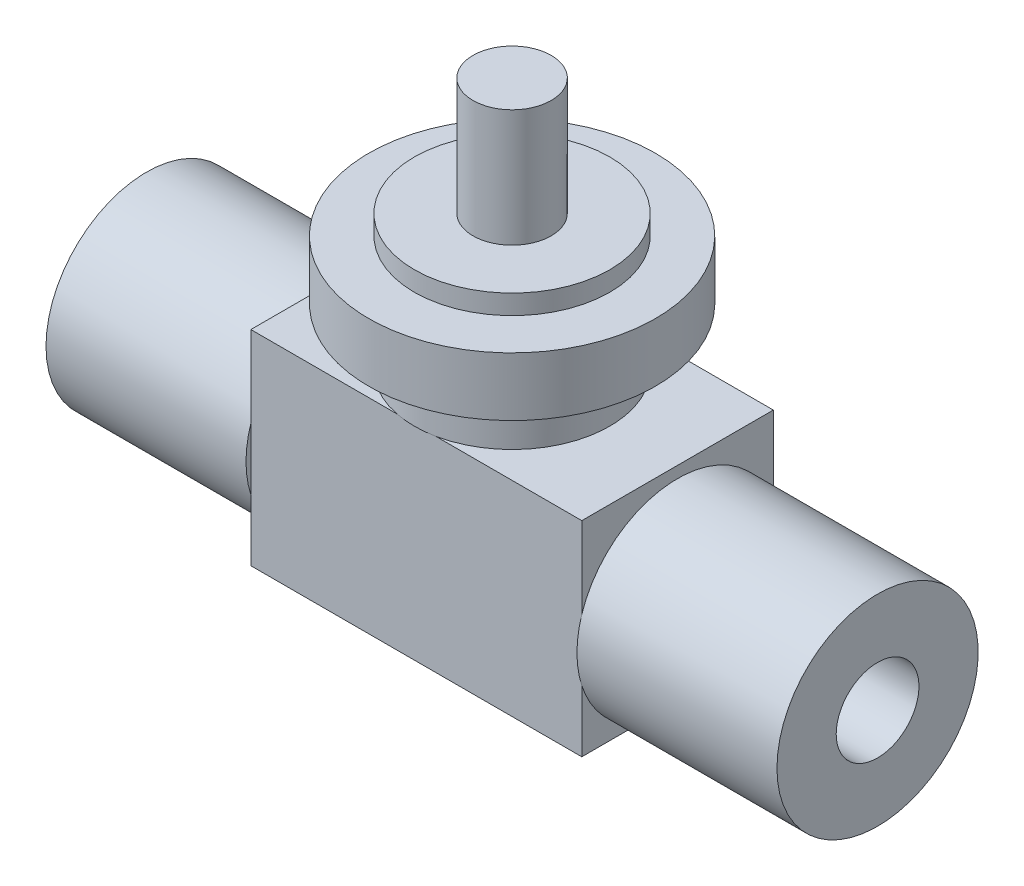
ISO-10303-21;
HEADER;
FILE_DESCRIPTION(('STEP AP214'),'2;1');
FILE_NAME('part.step','',(''),(''),'','','');
FILE_SCHEMA(('AUTOMOTIVE_DESIGN { 1 0 10303 214 1 1 1 1 }'));
ENDSEC;
DATA;
#1=APPLICATION_CONTEXT('core data for automotive mechanical design processes');
#2=APPLICATION_PROTOCOL_DEFINITION('international standard','automotive_design',2000,#1);
#3=PRODUCT_CONTEXT('',#1,'mechanical');
#4=PRODUCT('Part','Part','',(#3));
#5=PRODUCT_RELATED_PRODUCT_CATEGORY('part','',(#4));
#6=PRODUCT_DEFINITION_FORMATION('','',#4);
#7=PRODUCT_DEFINITION_CONTEXT('part definition',#1,'design');
#8=PRODUCT_DEFINITION('design','',#6,#7);
#9=PRODUCT_DEFINITION_SHAPE('','',#8);
#10=(LENGTH_UNIT() NAMED_UNIT(*) SI_UNIT(.MILLI.,.METRE.));
#11=(NAMED_UNIT(*) PLANE_ANGLE_UNIT() SI_UNIT($,.RADIAN.));
#12=(NAMED_UNIT(*) SI_UNIT($,.STERADIAN.) SOLID_ANGLE_UNIT());
#13=UNCERTAINTY_MEASURE_WITH_UNIT(LENGTH_MEASURE(1.E-05),#10,'distance_accuracy_value','');
#14=(GEOMETRIC_REPRESENTATION_CONTEXT(3) GLOBAL_UNCERTAINTY_ASSIGNED_CONTEXT((#13)) GLOBAL_UNIT_ASSIGNED_CONTEXT((#10,
#11,#12)) REPRESENTATION_CONTEXT('',''));
#15=CARTESIAN_POINT('',(0.,0.,0.));
#16=DIRECTION('',(0.,0.,1.));
#17=DIRECTION('',(1.,0.,0.));
#18=AXIS2_PLACEMENT_3D('',#15,#16,#17);
#19=CARTESIAN_POINT('',(12.7,8.6,7.35));
#20=DIRECTION('',(0.,-1.,0.));
#21=DIRECTION('',(0.,0.,-1.));
#22=AXIS2_PLACEMENT_3D('',#19,#20,#21);
#23=PLANE('',#22);
#24=DIRECTION('',(-1.,0.,0.));
#25=VECTOR('',#24,1.);
#26=CARTESIAN_POINT('',(12.7,8.6,-7.35));
#27=LINE('',#26,#25);
#28=CARTESIAN_POINT('',(12.7,8.6,-7.35));
#29=VERTEX_POINT('',#28);
#30=CARTESIAN_POINT('',(1.49248115565993,8.60000000000005,-7.35));
#31=VERTEX_POINT('',#30);
#32=EDGE_CURVE('E154',#29,#31,#27,.T.);
#33=ORIENTED_EDGE('',*,*,#32,.T.);
#34=CARTESIAN_POINT('',(0.,8.60000000000005,0.));
#35=DIRECTION('',(0.,-1.,0.));
#36=DIRECTION('',(0.,0.,-1.));
#37=AXIS2_PLACEMENT_3D('',#34,#35,#36);
#38=CIRCLE('',#37,7.5);
#39=CARTESIAN_POINT('',(1.49248115565993,8.60000000000005,7.35));
#40=VERTEX_POINT('',#39);
#41=EDGE_CURVE('E55',#31,#40,#38,.T.);
#42=ORIENTED_EDGE('',*,*,#41,.T.);
#43=DIRECTION('',(-1.,0.,0.));
#44=VECTOR('',#43,1.);
#45=CARTESIAN_POINT('',(12.7,8.6,7.35));
#46=LINE('',#45,#44);
#47=CARTESIAN_POINT('',(12.7,8.6,7.35));
#48=VERTEX_POINT('',#47);
#49=EDGE_CURVE('E189',#48,#40,#46,.T.);
#50=ORIENTED_EDGE('',*,*,#49,.F.);
#51=DIRECTION('',(0.,0.,-1.));
#52=VECTOR('',#51,1.);
#53=CARTESIAN_POINT('',(12.7,8.6,7.35));
#54=LINE('',#53,#52);
#55=EDGE_CURVE('E159',#48,#29,#54,.T.);
#56=ORIENTED_EDGE('',*,*,#55,.T.);
#57=EDGE_LOOP('',(#33,#42,#50,#56));
#58=FACE_BOUND('',#57,.T.);
#59=ADVANCED_FACE('F41',(#58),#23,.F.);
#60=CARTESIAN_POINT('',(-12.7,8.6,7.35));
#61=DIRECTION('',(1.,0.,0.));
#62=DIRECTION('',(0.,0.,-1.));
#63=AXIS2_PLACEMENT_3D('',#60,#61,#62);
#64=PLANE('',#63);
#65=CARTESIAN_POINT('',(-12.7,0.,0.));
#66=DIRECTION('',(-1.,0.,0.));
#67=DIRECTION('',(0.,0.,1.));
#68=AXIS2_PLACEMENT_3D('',#65,#66,#67);
#69=CIRCLE('',#68,7.722);
#70=CARTESIAN_POINT('',(-12.7,2.36786486100876,7.35));
#71=VERTEX_POINT('',#70);
#72=CARTESIAN_POINT('',(-12.7,2.36786486100876,-7.35));
#73=VERTEX_POINT('',#72);
#74=EDGE_CURVE('E69',#71,#73,#69,.T.);
#75=ORIENTED_EDGE('',*,*,#74,.F.);
#76=DIRECTION('',(0.,-1.,0.));
#77=VECTOR('',#76,1.);
#78=CARTESIAN_POINT('',(-12.7,8.6,7.35));
#79=LINE('',#78,#77);
#80=CARTESIAN_POINT('',(-12.7,8.6,7.35));
#81=VERTEX_POINT('',#80);
#82=EDGE_CURVE('E162',#81,#71,#79,.T.);
#83=ORIENTED_EDGE('',*,*,#82,.F.);
#84=DIRECTION('',(0.,0.,-1.));
#85=VECTOR('',#84,1.);
#86=CARTESIAN_POINT('',(-12.7,8.6,7.35));
#87=LINE('',#86,#85);
#88=CARTESIAN_POINT('',(-12.7,8.6,-7.35));
#89=VERTEX_POINT('',#88);
#90=EDGE_CURVE('E188',#81,#89,#87,.T.);
#91=ORIENTED_EDGE('',*,*,#90,.T.);
#92=DIRECTION('',(0.,-1.,0.));
#93=VECTOR('',#92,1.);
#94=CARTESIAN_POINT('',(-12.7,8.6,-7.35));
#95=LINE('',#94,#93);
#96=EDGE_CURVE('E179',#89,#73,#95,.T.);
#97=ORIENTED_EDGE('',*,*,#96,.T.);
#98=EDGE_LOOP('',(#75,#83,#91,#97));
#99=FACE_BOUND('',#98,.T.);
#100=ADVANCED_FACE('F251',(#99),#64,.F.);
#101=CARTESIAN_POINT('',(-12.7,-2.36786486100876,-7.35));
#102=VERTEX_POINT('',#101);
#103=CARTESIAN_POINT('',(-12.7,-7.1,-3.03632738682772));
#104=VERTEX_POINT('',#103);
#105=EDGE_CURVE('E49',#102,#104,#69,.T.);
#106=ORIENTED_EDGE('',*,*,#105,.F.);
#107=CARTESIAN_POINT('',(-12.7,-7.1,-7.35));
#108=VERTEX_POINT('',#107);
#109=EDGE_CURVE('E187',#102,#108,#95,.T.);
#110=ORIENTED_EDGE('',*,*,#109,.T.);
#111=DIRECTION('',(0.,0.,-1.));
#112=VECTOR('',#111,1.);
#113=CARTESIAN_POINT('',(-12.7,-7.1,7.35));
#114=LINE('',#113,#112);
#115=EDGE_CURVE('E366',#104,#108,#114,.T.);
#116=ORIENTED_EDGE('',*,*,#115,.F.);
#117=EDGE_LOOP('',(#106,#110,#116));
#118=FACE_BOUND('',#117,.T.);
#119=ADVANCED_FACE('F262',(#118),#64,.F.);
#120=CARTESIAN_POINT('',(12.7,-7.1,7.35));
#121=DIRECTION('',(-1.,0.,0.));
#122=DIRECTION('',(0.,0.,1.));
#123=AXIS2_PLACEMENT_3D('',#120,#121,#122);
#124=PLANE('',#123);
#125=DIRECTION('',(0.,1.,0.));
#126=VECTOR('',#125,1.);
#127=CARTESIAN_POINT('',(12.7,-7.1,7.35));
#128=LINE('',#127,#126);
#129=CARTESIAN_POINT('',(12.6999999999999,2.36786486100876,7.35));
#130=VERTEX_POINT('',#129);
#131=EDGE_CURVE('E197',#130,#48,#128,.T.);
#132=ORIENTED_EDGE('',*,*,#131,.F.);
#133=CARTESIAN_POINT('',(12.6999999999999,0.,0.));
#134=DIRECTION('',(-1.,0.,0.));
#135=DIRECTION('',(0.,0.,1.));
#136=AXIS2_PLACEMENT_3D('',#133,#134,#135);
#137=CIRCLE('',#136,7.722);
#138=CARTESIAN_POINT('',(12.6999999999999,2.36786486100876,-7.35));
#139=VERTEX_POINT('',#138);
#140=EDGE_CURVE('E204',#130,#139,#137,.T.);
#141=ORIENTED_EDGE('',*,*,#140,.T.);
#142=DIRECTION('',(0.,1.,0.));
#143=VECTOR('',#142,1.);
#144=CARTESIAN_POINT('',(12.7,-7.1,-7.35));
#145=LINE('',#144,#143);
#146=EDGE_CURVE('E171',#139,#29,#145,.T.);
#147=ORIENTED_EDGE('',*,*,#146,.T.);
#148=ORIENTED_EDGE('',*,*,#55,.F.);
#149=EDGE_LOOP('',(#132,#141,#147,#148));
#150=FACE_BOUND('',#149,.T.);
#151=ADVANCED_FACE('F273',(#150),#124,.F.);
#152=CARTESIAN_POINT('',(12.7,-7.1,-7.35));
#153=VERTEX_POINT('',#152);
#154=CARTESIAN_POINT('',(12.6999999999999,-2.36786486100876,-7.35));
#155=VERTEX_POINT('',#154);
#156=EDGE_CURVE('E164',#153,#155,#145,.T.);
#157=ORIENTED_EDGE('',*,*,#156,.T.);
#158=CARTESIAN_POINT('',(12.6999999999999,-7.1,-3.03632738682772));
#159=VERTEX_POINT('',#158);
#160=EDGE_CURVE('E343',#155,#159,#137,.T.);
#161=ORIENTED_EDGE('',*,*,#160,.T.);
#162=DIRECTION('',(0.,0.,-1.));
#163=VECTOR('',#162,1.);
#164=CARTESIAN_POINT('',(12.7,-7.1,7.35));
#165=LINE('',#164,#163);
#166=EDGE_CURVE('E372',#159,#153,#165,.T.);
#167=ORIENTED_EDGE('',*,*,#166,.T.);
#168=EDGE_LOOP('',(#157,#161,#167));
#169=FACE_BOUND('',#168,.T.);
#170=ADVANCED_FACE('F277',(#169),#124,.F.);
#171=CARTESIAN_POINT('',(-12.7,-7.1,3.03632738682772));
#172=VERTEX_POINT('',#171);
#173=CARTESIAN_POINT('',(-12.7,-2.36786486100876,7.35));
#174=VERTEX_POINT('',#173);
#175=EDGE_CURVE('E212',#172,#174,#69,.T.);
#176=ORIENTED_EDGE('',*,*,#175,.F.);
#177=CARTESIAN_POINT('',(-12.7,-7.1,7.35));
#178=VERTEX_POINT('',#177);
#179=EDGE_CURVE('E359',#178,#172,#114,.T.);
#180=ORIENTED_EDGE('',*,*,#179,.F.);
#181=EDGE_CURVE('E156',#174,#178,#79,.T.);
#182=ORIENTED_EDGE('',*,*,#181,.F.);
#183=EDGE_LOOP('',(#176,#180,#182));
#184=FACE_BOUND('',#183,.T.);
#185=ADVANCED_FACE('F43',(#184),#64,.F.);
#186=CARTESIAN_POINT('',(-12.7,-7.1,7.35));
#187=DIRECTION('',(0.,1.,0.));
#188=DIRECTION('',(0.,0.,1.));
#189=AXIS2_PLACEMENT_3D('',#186,#187,#188);
#190=PLANE('',#189);
#191=DIRECTION('',(1.,0.,0.));
#192=VECTOR('',#191,1.);
#193=CARTESIAN_POINT('',(-12.7,-7.1,-7.35));
#194=LINE('',#193,#192);
#195=EDGE_CURVE('E176',#108,#153,#194,.T.);
#196=ORIENTED_EDGE('',*,*,#195,.T.);
#197=ORIENTED_EDGE('',*,*,#166,.F.);
#198=CARTESIAN_POINT('',(12.6999999999999,-7.1,3.03632738682772));
#199=VERTEX_POINT('',#198);
#200=EDGE_CURVE('E373',#199,#159,#165,.T.);
#201=ORIENTED_EDGE('',*,*,#200,.F.);
#202=CARTESIAN_POINT('',(12.7,-7.1,7.35));
#203=VERTEX_POINT('',#202);
#204=EDGE_CURVE('E375',#203,#199,#165,.T.);
#205=ORIENTED_EDGE('',*,*,#204,.F.);
#206=DIRECTION('',(1.,0.,0.));
#207=VECTOR('',#206,1.);
#208=CARTESIAN_POINT('',(-12.7,-7.1,7.35));
#209=LINE('',#208,#207);
#210=EDGE_CURVE('E199',#178,#203,#209,.T.);
#211=ORIENTED_EDGE('',*,*,#210,.F.);
#212=ORIENTED_EDGE('',*,*,#179,.T.);
#213=EDGE_CURVE('E364',#172,#104,#114,.T.);
#214=ORIENTED_EDGE('',*,*,#213,.T.);
#215=ORIENTED_EDGE('',*,*,#115,.T.);
#216=EDGE_LOOP('',(#196,#197,#201,#205,#211,#212,#214,#215));
#217=FACE_BOUND('',#216,.T.);
#218=ADVANCED_FACE('F271',(#217),#190,.F.);
#219=ORIENTED_EDGE('',*,*,#204,.T.);
#220=CARTESIAN_POINT('',(12.6999999999999,-2.36786486100876,7.35));
#221=VERTEX_POINT('',#220);
#222=EDGE_CURVE('E210',#199,#221,#137,.T.);
#223=ORIENTED_EDGE('',*,*,#222,.T.);
#224=EDGE_CURVE('E194',#203,#221,#128,.T.);
#225=ORIENTED_EDGE('',*,*,#224,.F.);
#226=EDGE_LOOP('',(#219,#223,#225));
#227=FACE_BOUND('',#226,.T.);
#228=ADVANCED_FACE('F267',(#227),#124,.F.);
#229=CARTESIAN_POINT('',(-1.49248115565993,8.60000000000005,7.35));
#230=VERTEX_POINT('',#229);
#231=EDGE_CURVE('E195',#230,#81,#46,.T.);
#232=ORIENTED_EDGE('',*,*,#231,.F.);
#233=CARTESIAN_POINT('',(-1.49248115565993,8.60000000000005,-7.35));
#234=VERTEX_POINT('',#233);
#235=EDGE_CURVE('E11',#230,#234,#38,.T.);
#236=ORIENTED_EDGE('',*,*,#235,.T.);
#237=EDGE_CURVE('E153',#234,#89,#27,.T.);
#238=ORIENTED_EDGE('',*,*,#237,.T.);
#239=ORIENTED_EDGE('',*,*,#90,.F.);
#240=EDGE_LOOP('',(#232,#236,#238,#239));
#241=FACE_BOUND('',#240,.T.);
#242=ADVANCED_FACE('F257',(#241),#23,.F.);
#243=CARTESIAN_POINT('',(0.,0.,7.35));
#244=DIRECTION('',(0.,0.,1.));
#245=DIRECTION('',(1.,0.,0.));
#246=AXIS2_PLACEMENT_3D('',#243,#244,#245);
#247=PLANE('',#246);
#248=ORIENTED_EDGE('',*,*,#82,.T.);
#249=EDGE_CURVE('E158',#71,#174,#79,.T.);
#250=ORIENTED_EDGE('',*,*,#249,.T.);
#251=ORIENTED_EDGE('',*,*,#181,.T.);
#252=ORIENTED_EDGE('',*,*,#210,.T.);
#253=ORIENTED_EDGE('',*,*,#224,.T.);
#254=EDGE_CURVE('E196',#221,#130,#128,.T.);
#255=ORIENTED_EDGE('',*,*,#254,.T.);
#256=ORIENTED_EDGE('',*,*,#131,.T.);
#257=ORIENTED_EDGE('',*,*,#49,.T.);
#258=EDGE_CURVE('E192',#40,#230,#46,.T.);
#259=ORIENTED_EDGE('',*,*,#258,.T.);
#260=ORIENTED_EDGE('',*,*,#231,.T.);
#261=EDGE_LOOP('',(#248,#250,#251,#252,#253,#255,#256,#257,#259,#260));
#262=FACE_BOUND('',#261,.T.);
#263=ADVANCED_FACE('F265',(#262),#247,.T.);
#264=CARTESIAN_POINT('',(0.,0.,-7.35));
#265=DIRECTION('',(0.,0.,1.));
#266=DIRECTION('',(1.,0.,0.));
#267=AXIS2_PLACEMENT_3D('',#264,#265,#266);
#268=PLANE('',#267);
#269=ORIENTED_EDGE('',*,*,#96,.F.);
#270=ORIENTED_EDGE('',*,*,#237,.F.);
#271=EDGE_CURVE('E137',#31,#234,#27,.T.);
#272=ORIENTED_EDGE('',*,*,#271,.F.);
#273=ORIENTED_EDGE('',*,*,#32,.F.);
#274=ORIENTED_EDGE('',*,*,#146,.F.);
#275=EDGE_CURVE('E167',#155,#139,#145,.T.);
#276=ORIENTED_EDGE('',*,*,#275,.F.);
#277=ORIENTED_EDGE('',*,*,#156,.F.);
#278=ORIENTED_EDGE('',*,*,#195,.F.);
#279=ORIENTED_EDGE('',*,*,#109,.F.);
#280=EDGE_CURVE('E183',#73,#102,#95,.T.);
#281=ORIENTED_EDGE('',*,*,#280,.F.);
#282=EDGE_LOOP('',(#269,#270,#272,#273,#274,#276,#277,#278,#279,#281));
#283=FACE_BOUND('',#282,.T.);
#284=ADVANCED_FACE('F151',(#283),#268,.F.);
#285=CARTESIAN_POINT('',(12.7,7.722,0.));
#286=DIRECTION('',(1.,0.,0.));
#287=DIRECTION('',(0.,0.,-1.));
#288=AXIS2_PLACEMENT_3D('',#285,#286,#287);
#289=PLANE('',#288);
#290=EDGE_CURVE('E203',#139,#155,#137,.T.);
#291=ORIENTED_EDGE('',*,*,#290,.T.);
#292=ORIENTED_EDGE('',*,*,#275,.T.);
#293=EDGE_LOOP('',(#291,#292));
#294=FACE_BOUND('',#293,.T.);
#295=ADVANCED_FACE('F332',(#294),#289,.F.);
#296=EDGE_CURVE('E341',#159,#199,#137,.T.);
#297=ORIENTED_EDGE('',*,*,#296,.T.);
#298=ORIENTED_EDGE('',*,*,#200,.T.);
#299=EDGE_LOOP('',(#297,#298));
#300=FACE_BOUND('',#299,.T.);
#301=ADVANCED_FACE('F328',(#300),#289,.F.);
#302=ORIENTED_EDGE('',*,*,#254,.F.);
#303=EDGE_CURVE('E207',#221,#130,#137,.T.);
#304=ORIENTED_EDGE('',*,*,#303,.T.);
#305=EDGE_LOOP('',(#302,#304));
#306=FACE_BOUND('',#305,.T.);
#307=ADVANCED_FACE('F326',(#306),#289,.F.);
#308=CARTESIAN_POINT('',(28.05,0.,0.));
#309=DIRECTION('',(-1.,0.,0.));
#310=DIRECTION('',(0.,0.,1.));
#311=AXIS2_PLACEMENT_3D('',#308,#309,#310);
#312=PLANE('',#311);
#313=CARTESIAN_POINT('',(28.0499999999999,0.,0.));
#314=DIRECTION('',(-1.,0.,0.));
#315=DIRECTION('',(0.,0.,1.));
#316=AXIS2_PLACEMENT_3D('',#313,#314,#315);
#317=CIRCLE('',#316,3.175);
#318=CARTESIAN_POINT('',(28.0499999999999,0.,3.175));
#319=VERTEX_POINT('',#318);
#320=EDGE_CURVE('E213',#319,#319,#317,.F.);
#321=ORIENTED_EDGE('',*,*,#320,.F.);
#322=EDGE_LOOP('',(#321));
#323=FACE_BOUND('',#322,.T.);
#324=CARTESIAN_POINT('',(28.0499999999999,0.,0.));
#325=DIRECTION('',(-1.,0.,0.));
#326=DIRECTION('',(0.,0.,1.));
#327=AXIS2_PLACEMENT_3D('',#324,#325,#326);
#328=CIRCLE('',#327,7.722);
#329=CARTESIAN_POINT('',(28.0499999999999,0.,7.722));
#330=VERTEX_POINT('',#329);
#331=EDGE_CURVE('E200',#330,#330,#328,.T.);
#332=ORIENTED_EDGE('',*,*,#331,.F.);
#333=EDGE_LOOP('',(#332));
#334=FACE_BOUND('',#333,.T.);
#335=ADVANCED_FACE('F325',(#323,#334),#312,.F.);
#336=CARTESIAN_POINT('',(-1000.,0.,0.));
#337=DIRECTION('',(-1.,0.,0.));
#338=DIRECTION('',(0.,0.,1.));
#339=AXIS2_PLACEMENT_3D('',#336,#337,#338);
#340=CYLINDRICAL_SURFACE('',#339,7.722);
#341=ORIENTED_EDGE('',*,*,#140,.F.);
#342=ORIENTED_EDGE('',*,*,#303,.F.);
#343=ORIENTED_EDGE('',*,*,#222,.F.);
#344=ORIENTED_EDGE('',*,*,#296,.F.);
#345=ORIENTED_EDGE('',*,*,#160,.F.);
#346=ORIENTED_EDGE('',*,*,#290,.F.);
#347=EDGE_LOOP('',(#341,#342,#343,#344,#345,#346));
#348=FACE_BOUND('',#347,.T.);
#349=ORIENTED_EDGE('',*,*,#331,.T.);
#350=EDGE_LOOP('',(#349));
#351=FACE_BOUND('',#350,.T.);
#352=ADVANCED_FACE('F316',(#348,#351),#340,.T.);
#353=CARTESIAN_POINT('',(-12.7,0.,0.));
#354=DIRECTION('',(-1.,0.,0.));
#355=DIRECTION('',(0.,0.,1.));
#356=AXIS2_PLACEMENT_3D('',#353,#354,#355);
#357=PLANE('',#356);
#358=EDGE_CURVE('E209',#73,#102,#69,.T.);
#359=ORIENTED_EDGE('',*,*,#358,.F.);
#360=ORIENTED_EDGE('',*,*,#280,.T.);
#361=EDGE_LOOP('',(#359,#360));
#362=FACE_BOUND('',#361,.T.);
#363=ADVANCED_FACE('F313',(#362),#357,.F.);
#364=ORIENTED_EDGE('',*,*,#213,.F.);
#365=EDGE_CURVE('E357',#104,#172,#69,.T.);
#366=ORIENTED_EDGE('',*,*,#365,.F.);
#367=EDGE_LOOP('',(#364,#366));
#368=FACE_BOUND('',#367,.T.);
#369=ADVANCED_FACE('F314',(#368),#357,.F.);
#370=CARTESIAN_POINT('',(-28.05,7.722,0.));
#371=DIRECTION('',(1.,0.,0.));
#372=DIRECTION('',(0.,0.,-1.));
#373=AXIS2_PLACEMENT_3D('',#370,#371,#372);
#374=PLANE('',#373);
#375=CARTESIAN_POINT('',(-28.05,0.,0.));
#376=DIRECTION('',(1.,0.,0.));
#377=DIRECTION('',(0.,0.,-1.));
#378=AXIS2_PLACEMENT_3D('',#375,#376,#377);
#379=CIRCLE('',#378,3.175);
#380=CARTESIAN_POINT('',(-28.05,0.,-3.175));
#381=VERTEX_POINT('',#380);
#382=EDGE_CURVE('E44',#381,#381,#379,.F.);
#383=ORIENTED_EDGE('',*,*,#382,.F.);
#384=EDGE_LOOP('',(#383));
#385=FACE_BOUND('',#384,.T.);
#386=CARTESIAN_POINT('',(-28.05,0.,0.));
#387=DIRECTION('',(-1.,0.,0.));
#388=DIRECTION('',(0.,0.,1.));
#389=AXIS2_PLACEMENT_3D('',#386,#387,#388);
#390=CIRCLE('',#389,7.722);
#391=CARTESIAN_POINT('',(-28.05,0.,7.722));
#392=VERTEX_POINT('',#391);
#393=EDGE_CURVE('E215',#392,#392,#390,.T.);
#394=ORIENTED_EDGE('',*,*,#393,.T.);
#395=EDGE_LOOP('',(#394));
#396=FACE_BOUND('',#395,.T.);
#397=ADVANCED_FACE('F315',(#385,#396),#374,.F.);
#398=ORIENTED_EDGE('',*,*,#249,.F.);
#399=EDGE_CURVE('E208',#174,#71,#69,.T.);
#400=ORIENTED_EDGE('',*,*,#399,.F.);
#401=EDGE_LOOP('',(#398,#400));
#402=FACE_BOUND('',#401,.T.);
#403=ADVANCED_FACE('F308',(#402),#357,.F.);
#404=CARTESIAN_POINT('',(-1000.,0.,0.));
#405=DIRECTION('',(-1.,0.,0.));
#406=DIRECTION('',(0.,0.,1.));
#407=AXIS2_PLACEMENT_3D('',#404,#405,#406);
#408=CYLINDRICAL_SURFACE('',#407,7.722);
#409=ORIENTED_EDGE('',*,*,#393,.F.);
#410=EDGE_LOOP('',(#409));
#411=FACE_BOUND('',#410,.T.);
#412=ORIENTED_EDGE('',*,*,#74,.T.);
#413=ORIENTED_EDGE('',*,*,#358,.T.);
#414=ORIENTED_EDGE('',*,*,#105,.T.);
#415=ORIENTED_EDGE('',*,*,#365,.T.);
#416=ORIENTED_EDGE('',*,*,#175,.T.);
#417=ORIENTED_EDGE('',*,*,#399,.T.);
#418=EDGE_LOOP('',(#412,#413,#414,#415,#416,#417));
#419=FACE_BOUND('',#418,.T.);
#420=ADVANCED_FACE('F301',(#411,#419),#408,.T.);
#421=CARTESIAN_POINT('',(-1000.,0.,0.));
#422=DIRECTION('',(-1.,0.,0.));
#423=DIRECTION('',(0.,0.,1.));
#424=AXIS2_PLACEMENT_3D('',#421,#422,#423);
#425=CYLINDRICAL_SURFACE('',#424,3.175);
#426=CARTESIAN_POINT('',(12.85,0.,0.));
#427=DIRECTION('',(-1.,0.,0.));
#428=DIRECTION('',(0.,0.,1.));
#429=AXIS2_PLACEMENT_3D('',#426,#427,#428);
#430=CIRCLE('',#429,3.175);
#431=CARTESIAN_POINT('',(12.85,0.,3.175));
#432=VERTEX_POINT('',#431);
#433=EDGE_CURVE('E216',#432,#432,#430,.T.);
#434=ORIENTED_EDGE('',*,*,#433,.T.);
#435=EDGE_LOOP('',(#434));
#436=FACE_BOUND('',#435,.T.);
#437=ORIENTED_EDGE('',*,*,#320,.T.);
#438=EDGE_LOOP('',(#437));
#439=FACE_BOUND('',#438,.T.);
#440=ADVANCED_FACE('F296',(#436,#439),#425,.F.);
#441=CARTESIAN_POINT('',(12.85,3.175,0.));
#442=DIRECTION('',(1.,0.,0.));
#443=DIRECTION('',(0.,0.,-1.));
#444=AXIS2_PLACEMENT_3D('',#441,#442,#443);
#445=PLANE('',#444);
#446=ORIENTED_EDGE('',*,*,#433,.F.);
#447=EDGE_LOOP('',(#446));
#448=FACE_BOUND('',#447,.T.);
#449=ADVANCED_FACE('F294',(#448),#445,.T.);
#450=CARTESIAN_POINT('',(-1000.,0.,0.));
#451=DIRECTION('',(-1.,0.,0.));
#452=DIRECTION('',(0.,0.,1.));
#453=AXIS2_PLACEMENT_3D('',#450,#451,#452);
#454=CYLINDRICAL_SURFACE('',#453,3.175);
#455=CARTESIAN_POINT('',(-12.85,0.,0.));
#456=DIRECTION('',(-1.,0.,0.));
#457=DIRECTION('',(0.,0.,1.));
#458=AXIS2_PLACEMENT_3D('',#455,#456,#457);
#459=CIRCLE('',#458,3.175);
#460=CARTESIAN_POINT('',(-12.85,0.,3.175));
#461=VERTEX_POINT('',#460);
#462=EDGE_CURVE('E147',#461,#461,#459,.T.);
#463=ORIENTED_EDGE('',*,*,#462,.F.);
#464=EDGE_LOOP('',(#463));
#465=FACE_BOUND('',#464,.T.);
#466=ORIENTED_EDGE('',*,*,#382,.T.);
#467=EDGE_LOOP('',(#466));
#468=FACE_BOUND('',#467,.T.);
#469=ADVANCED_FACE('F289',(#465,#468),#454,.F.);
#470=CARTESIAN_POINT('',(-12.85,0.,0.));
#471=DIRECTION('',(-1.,0.,0.));
#472=DIRECTION('',(0.,0.,1.));
#473=AXIS2_PLACEMENT_3D('',#470,#471,#472);
#474=PLANE('',#473);
#475=ORIENTED_EDGE('',*,*,#462,.T.);
#476=EDGE_LOOP('',(#475));
#477=FACE_BOUND('',#476,.T.);
#478=ADVANCED_FACE('F282',(#477),#474,.T.);
#479=CARTESIAN_POINT('',(0.,8.6,0.));
#480=DIRECTION('',(0.,-1.,0.));
#481=DIRECTION('',(0.,0.,-1.));
#482=AXIS2_PLACEMENT_3D('',#479,#480,#481);
#483=PLANE('',#482);
#484=ORIENTED_EDGE('',*,*,#258,.F.);
#485=EDGE_CURVE('E52',#40,#230,#38,.T.);
#486=ORIENTED_EDGE('',*,*,#485,.T.);
#487=EDGE_LOOP('',(#484,#486));
#488=FACE_BOUND('',#487,.T.);
#489=ADVANCED_FACE('F278',(#488),#483,.T.);
#490=EDGE_CURVE('E58',#234,#31,#38,.T.);
#491=ORIENTED_EDGE('',*,*,#490,.T.);
#492=ORIENTED_EDGE('',*,*,#271,.T.);
#493=EDGE_LOOP('',(#491,#492));
#494=FACE_BOUND('',#493,.T.);
#495=ADVANCED_FACE('F133',(#494),#483,.T.);
#496=CARTESIAN_POINT('',(0.,-500.,0.));
#497=DIRECTION('',(0.,-1.,0.));
#498=DIRECTION('',(0.,0.,-1.));
#499=AXIS2_PLACEMENT_3D('',#496,#497,#498);
#500=CYLINDRICAL_SURFACE('',#499,7.5);
#501=CARTESIAN_POINT('',(0.,13.,0.));
#502=DIRECTION('',(0.,-1.,0.));
#503=DIRECTION('',(0.,0.,-1.));
#504=AXIS2_PLACEMENT_3D('',#501,#502,#503);
#505=CIRCLE('',#504,7.5);
#506=CARTESIAN_POINT('',(0.,13.,-7.5));
#507=VERTEX_POINT('',#506);
#508=EDGE_CURVE('E140',#507,#507,#505,.T.);
#509=ORIENTED_EDGE('',*,*,#508,.T.);
#510=EDGE_LOOP('',(#509));
#511=FACE_BOUND('',#510,.T.);
#512=ORIENTED_EDGE('',*,*,#41,.F.);
#513=ORIENTED_EDGE('',*,*,#490,.F.);
#514=ORIENTED_EDGE('',*,*,#235,.F.);
#515=ORIENTED_EDGE('',*,*,#485,.F.);
#516=EDGE_LOOP('',(#512,#513,#514,#515));
#517=FACE_BOUND('',#516,.T.);
#518=ADVANCED_FACE('F138',(#511,#517),#500,.T.);
#519=CARTESIAN_POINT('',(7.5,13.,0.));
#520=DIRECTION('',(0.,-1.,0.));
#521=DIRECTION('',(0.,0.,-1.));
#522=AXIS2_PLACEMENT_3D('',#519,#520,#521);
#523=PLANE('',#522);
#524=CARTESIAN_POINT('',(0.,13.,0.));
#525=DIRECTION('',(0.,-1.,0.));
#526=DIRECTION('',(0.,0.,-1.));
#527=AXIS2_PLACEMENT_3D('',#524,#525,#526);
#528=CIRCLE('',#527,11.);
#529=CARTESIAN_POINT('',(0.,13.,-11.));
#530=VERTEX_POINT('',#529);
#531=EDGE_CURVE('E224',#530,#530,#528,.T.);
#532=ORIENTED_EDGE('',*,*,#531,.T.);
#533=EDGE_LOOP('',(#532));
#534=FACE_BOUND('',#533,.T.);
#535=ORIENTED_EDGE('',*,*,#508,.F.);
#536=EDGE_LOOP('',(#535));
#537=FACE_BOUND('',#536,.T.);
#538=ADVANCED_FACE('F540',(#534,#537),#523,.T.);
#539=CARTESIAN_POINT('',(0.,-500.,0.));
#540=DIRECTION('',(0.,-1.,0.));
#541=DIRECTION('',(0.,0.,-1.));
#542=AXIS2_PLACEMENT_3D('',#539,#540,#541);
#543=CYLINDRICAL_SURFACE('',#542,11.);
#544=CARTESIAN_POINT('',(0.,17.5,0.));
#545=DIRECTION('',(0.,-1.,0.));
#546=DIRECTION('',(0.,0.,-1.));
#547=AXIS2_PLACEMENT_3D('',#544,#545,#546);
#548=CIRCLE('',#547,11.);
#549=CARTESIAN_POINT('',(0.,17.5,-11.));
#550=VERTEX_POINT('',#549);
#551=EDGE_CURVE('E228',#550,#550,#548,.T.);
#552=ORIENTED_EDGE('',*,*,#551,.T.);
#553=EDGE_LOOP('',(#552));
#554=FACE_BOUND('',#553,.T.);
#555=ORIENTED_EDGE('',*,*,#531,.F.);
#556=EDGE_LOOP('',(#555));
#557=FACE_BOUND('',#556,.T.);
#558=ADVANCED_FACE('F545',(#554,#557),#543,.T.);
#559=CARTESIAN_POINT('',(11.,17.5,0.));
#560=DIRECTION('',(0.,1.,0.));
#561=DIRECTION('',(0.,0.,1.));
#562=AXIS2_PLACEMENT_3D('',#559,#560,#561);
#563=PLANE('',#562);
#564=CARTESIAN_POINT('',(0.,17.5,0.));
#565=DIRECTION('',(0.,-1.,0.));
#566=DIRECTION('',(0.,0.,-1.));
#567=AXIS2_PLACEMENT_3D('',#564,#565,#566);
#568=CIRCLE('',#567,7.5);
#569=CARTESIAN_POINT('',(0.,17.5,-7.5));
#570=VERTEX_POINT('',#569);
#571=EDGE_CURVE('E230',#570,#570,#568,.T.);
#572=ORIENTED_EDGE('',*,*,#571,.T.);
#573=EDGE_LOOP('',(#572));
#574=FACE_BOUND('',#573,.T.);
#575=ORIENTED_EDGE('',*,*,#551,.F.);
#576=EDGE_LOOP('',(#575));
#577=FACE_BOUND('',#576,.T.);
#578=ADVANCED_FACE('F551',(#574,#577),#563,.T.);
#579=CARTESIAN_POINT('',(0.,-500.,0.));
#580=DIRECTION('',(0.,-1.,0.));
#581=DIRECTION('',(0.,0.,-1.));
#582=AXIS2_PLACEMENT_3D('',#579,#580,#581);
#583=CYLINDRICAL_SURFACE('',#582,7.5);
#584=CARTESIAN_POINT('',(0.,19.,0.));
#585=DIRECTION('',(0.,-1.,0.));
#586=DIRECTION('',(0.,0.,-1.));
#587=AXIS2_PLACEMENT_3D('',#584,#585,#586);
#588=CIRCLE('',#587,7.5);
#589=CARTESIAN_POINT('',(0.,19.,-7.5));
#590=VERTEX_POINT('',#589);
#591=EDGE_CURVE('E235',#590,#590,#588,.T.);
#592=ORIENTED_EDGE('',*,*,#591,.T.);
#593=EDGE_LOOP('',(#592));
#594=FACE_BOUND('',#593,.T.);
#595=ORIENTED_EDGE('',*,*,#571,.F.);
#596=EDGE_LOOP('',(#595));
#597=FACE_BOUND('',#596,.T.);
#598=ADVANCED_FACE('F565',(#594,#597),#583,.T.);
#599=CARTESIAN_POINT('',(7.5,19.,0.));
#600=DIRECTION('',(0.,1.,0.));
#601=DIRECTION('',(0.,0.,1.));
#602=AXIS2_PLACEMENT_3D('',#599,#600,#601);
#603=PLANE('',#602);
#604=CARTESIAN_POINT('',(0.,19.,0.));
#605=DIRECTION('',(0.,-1.,0.));
#606=DIRECTION('',(0.,0.,-1.));
#607=AXIS2_PLACEMENT_3D('',#604,#605,#606);
#608=CIRCLE('',#607,3.);
#609=CARTESIAN_POINT('',(0.,19.,-3.));
#610=VERTEX_POINT('',#609);
#611=EDGE_CURVE('E232',#610,#610,#608,.T.);
#612=ORIENTED_EDGE('',*,*,#611,.T.);
#613=EDGE_LOOP('',(#612));
#614=FACE_BOUND('',#613,.T.);
#615=ORIENTED_EDGE('',*,*,#591,.F.);
#616=EDGE_LOOP('',(#615));
#617=FACE_BOUND('',#616,.T.);
#618=ADVANCED_FACE('F252',(#614,#617),#603,.T.);
#619=CARTESIAN_POINT('',(0.,-500.,0.));
#620=DIRECTION('',(0.,-1.,0.));
#621=DIRECTION('',(0.,0.,-1.));
#622=AXIS2_PLACEMENT_3D('',#619,#620,#621);
#623=CYLINDRICAL_SURFACE('',#622,3.);
#624=CARTESIAN_POINT('',(0.,28.,0.));
#625=DIRECTION('',(0.,-1.,0.));
#626=DIRECTION('',(0.,0.,-1.));
#627=AXIS2_PLACEMENT_3D('',#624,#625,#626);
#628=CIRCLE('',#627,3.);
#629=CARTESIAN_POINT('',(0.,28.,-3.));
#630=VERTEX_POINT('',#629);
#631=EDGE_CURVE('E238',#630,#630,#628,.T.);
#632=ORIENTED_EDGE('',*,*,#631,.T.);
#633=EDGE_LOOP('',(#632));
#634=FACE_BOUND('',#633,.T.);
#635=ORIENTED_EDGE('',*,*,#611,.F.);
#636=EDGE_LOOP('',(#635));
#637=FACE_BOUND('',#636,.T.);
#638=ADVANCED_FACE('F245',(#634,#637),#623,.T.);
#639=CARTESIAN_POINT('',(3.,28.,0.));
#640=DIRECTION('',(0.,1.,0.));
#641=DIRECTION('',(0.,0.,1.));
#642=AXIS2_PLACEMENT_3D('',#639,#640,#641);
#643=PLANE('',#642);
#644=ORIENTED_EDGE('',*,*,#631,.F.);
#645=EDGE_LOOP('',(#644));
#646=FACE_BOUND('',#645,.T.);
#647=ADVANCED_FACE('F244',(#646),#643,.T.);
#648=CLOSED_SHELL('',(#59,#100,#119,#151,#170,#185,#218,#228,#242,#263,#284,#295,#301,#307,#335,
#352,#363,#369,#397,#403,#420,#440,#449,#469,#478,#489,#495,#518,#538,#558,#578,#598,#618,#638,#647));
#649=MANIFOLD_SOLID_BREP('B2',#648);
#650=ADVANCED_BREP_SHAPE_REPRESENTATION('',(#18,#649),#14);
#651=SHAPE_DEFINITION_REPRESENTATION(#9,#650);
ENDSEC;
END-ISO-10303-21;
